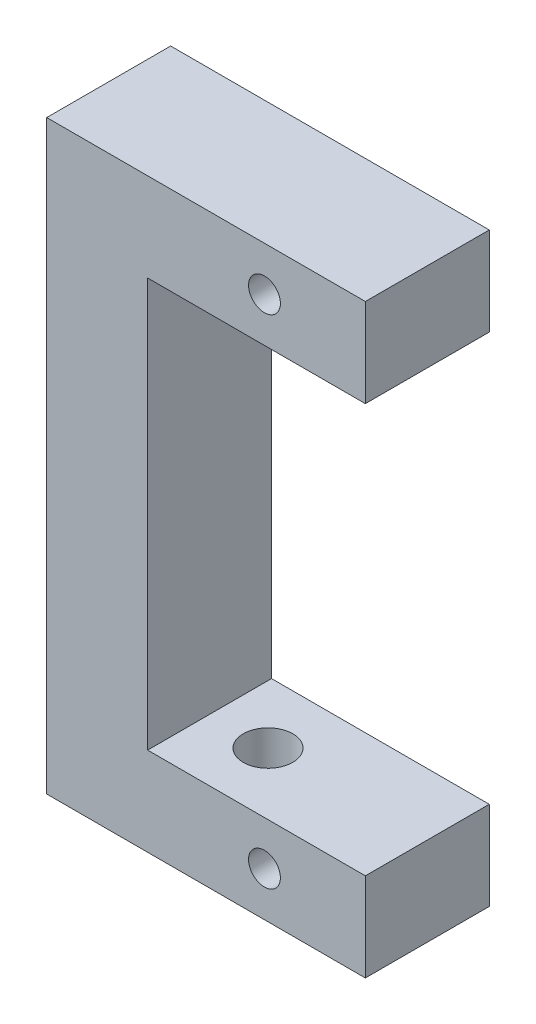
ISO-10303-21;
HEADER;
FILE_DESCRIPTION(('STEP AP214'),'2;1');
FILE_NAME('part.step','',(''),(''),'','','');
FILE_SCHEMA(('AUTOMOTIVE_DESIGN { 1 0 10303 214 1 1 1 1 }'));
ENDSEC;
DATA;
#1=APPLICATION_CONTEXT('core data for automotive mechanical design processes');
#2=APPLICATION_PROTOCOL_DEFINITION('international standard','automotive_design',2000,#1);
#3=PRODUCT_CONTEXT('',#1,'mechanical');
#4=PRODUCT('Part','Part','',(#3));
#5=PRODUCT_RELATED_PRODUCT_CATEGORY('part','',(#4));
#6=PRODUCT_DEFINITION_FORMATION('','',#4);
#7=PRODUCT_DEFINITION_CONTEXT('part definition',#1,'design');
#8=PRODUCT_DEFINITION('design','',#6,#7);
#9=PRODUCT_DEFINITION_SHAPE('','',#8);
#10=(LENGTH_UNIT() NAMED_UNIT(*) SI_UNIT(.MILLI.,.METRE.));
#11=(NAMED_UNIT(*) PLANE_ANGLE_UNIT() SI_UNIT($,.RADIAN.));
#12=(NAMED_UNIT(*) SI_UNIT($,.STERADIAN.) SOLID_ANGLE_UNIT());
#13=UNCERTAINTY_MEASURE_WITH_UNIT(LENGTH_MEASURE(1.E-05),#10,'distance_accuracy_value','');
#14=(GEOMETRIC_REPRESENTATION_CONTEXT(3) GLOBAL_UNCERTAINTY_ASSIGNED_CONTEXT((#13)) GLOBAL_UNIT_ASSIGNED_CONTEXT((#10,
#11,#12)) REPRESENTATION_CONTEXT('',''));
#15=CARTESIAN_POINT('',(0.,0.,0.));
#16=DIRECTION('',(0.,0.,1.));
#17=DIRECTION('',(1.,0.,0.));
#18=AXIS2_PLACEMENT_3D('',#15,#16,#17);
#19=CARTESIAN_POINT('',(8.30000000000001,16.55,7.));
#20=DIRECTION('',(-1.,0.,0.));
#21=DIRECTION('',(0.,-1.,0.));
#22=AXIS2_PLACEMENT_3D('',#19,#20,#21);
#23=PLANE('',#22);
#24=DIRECTION('',(0.,1.,0.));
#25=VECTOR('',#24,1.);
#26=CARTESIAN_POINT('',(8.30000000000001,16.55,0.));
#27=LINE('',#26,#25);
#28=CARTESIAN_POINT('',(8.3,11.55,0.));
#29=VERTEX_POINT('',#28);
#30=CARTESIAN_POINT('',(8.30000000000001,16.55,0.));
#31=VERTEX_POINT('',#30);
#32=EDGE_CURVE('E129',#29,#31,#27,.T.);
#33=ORIENTED_EDGE('',*,*,#32,.T.);
#34=DIRECTION('',(0.,0.,-1.));
#35=VECTOR('',#34,1.);
#36=CARTESIAN_POINT('',(8.30000000000001,16.55,7.));
#37=LINE('',#36,#35);
#38=CARTESIAN_POINT('',(8.30000000000001,16.55,7.));
#39=VERTEX_POINT('',#38);
#40=EDGE_CURVE('E11',#39,#31,#37,.T.);
#41=ORIENTED_EDGE('',*,*,#40,.F.);
#42=DIRECTION('',(0.,1.,0.));
#43=VECTOR('',#42,1.);
#44=CARTESIAN_POINT('',(8.30000000000001,16.55,7.));
#45=LINE('',#44,#43);
#46=CARTESIAN_POINT('',(8.3,11.55,7.));
#47=VERTEX_POINT('',#46);
#48=EDGE_CURVE('E144',#47,#39,#45,.T.);
#49=ORIENTED_EDGE('',*,*,#48,.F.);
#50=DIRECTION('',(0.,0.,-1.));
#51=VECTOR('',#50,1.);
#52=CARTESIAN_POINT('',(8.3,11.55,7.));
#53=LINE('',#52,#51);
#54=EDGE_CURVE('E125',#47,#29,#53,.T.);
#55=ORIENTED_EDGE('',*,*,#54,.T.);
#56=EDGE_LOOP('',(#33,#41,#49,#55));
#57=FACE_BOUND('',#56,.T.);
#58=ADVANCED_FACE('F33',(#57),#23,.F.);
#59=CARTESIAN_POINT('',(-9.69999999999999,16.55,7.));
#60=DIRECTION('',(0.,-1.,0.));
#61=DIRECTION('',(0.,0.,-1.));
#62=AXIS2_PLACEMENT_3D('',#59,#60,#61);
#63=PLANE('',#62);
#64=DIRECTION('',(-1.,0.,0.));
#65=VECTOR('',#64,1.);
#66=CARTESIAN_POINT('',(-9.69999999999999,16.55,0.));
#67=LINE('',#66,#65);
#68=CARTESIAN_POINT('',(-9.69999999999999,16.55,0.));
#69=VERTEX_POINT('',#68);
#70=EDGE_CURVE('E132',#31,#69,#67,.T.);
#71=ORIENTED_EDGE('',*,*,#70,.T.);
#72=DIRECTION('',(0.,0.,-1.));
#73=VECTOR('',#72,1.);
#74=CARTESIAN_POINT('',(-9.69999999999999,16.55,7.));
#75=LINE('',#74,#73);
#76=CARTESIAN_POINT('',(-9.69999999999999,16.55,7.));
#77=VERTEX_POINT('',#76);
#78=EDGE_CURVE('E41',#77,#69,#75,.T.);
#79=ORIENTED_EDGE('',*,*,#78,.F.);
#80=DIRECTION('',(-1.,0.,0.));
#81=VECTOR('',#80,1.);
#82=CARTESIAN_POINT('',(-9.69999999999999,16.55,7.));
#83=LINE('',#82,#81);
#84=EDGE_CURVE('E92',#39,#77,#83,.T.);
#85=ORIENTED_EDGE('',*,*,#84,.F.);
#86=ORIENTED_EDGE('',*,*,#40,.T.);
#87=EDGE_LOOP('',(#71,#79,#85,#86));
#88=FACE_BOUND('',#87,.T.);
#89=ADVANCED_FACE('F205',(#88),#63,.F.);
#90=CARTESIAN_POINT('',(-9.69999999999999,-16.55,7.));
#91=DIRECTION('',(1.,0.,0.));
#92=DIRECTION('',(0.,0.,-1.));
#93=AXIS2_PLACEMENT_3D('',#90,#91,#92);
#94=PLANE('',#93);
#95=DIRECTION('',(0.,-1.,0.));
#96=VECTOR('',#95,1.);
#97=CARTESIAN_POINT('',(-9.69999999999999,-16.55,0.));
#98=LINE('',#97,#96);
#99=CARTESIAN_POINT('',(-9.69999999999999,-16.55,0.));
#100=VERTEX_POINT('',#99);
#101=EDGE_CURVE('E135',#69,#100,#98,.T.);
#102=ORIENTED_EDGE('',*,*,#101,.T.);
#103=DIRECTION('',(0.,0.,-1.));
#104=VECTOR('',#103,1.);
#105=CARTESIAN_POINT('',(-9.69999999999999,-16.55,7.));
#106=LINE('',#105,#104);
#107=CARTESIAN_POINT('',(-9.69999999999999,-16.55,7.));
#108=VERTEX_POINT('',#107);
#109=EDGE_CURVE('E151',#108,#100,#106,.T.);
#110=ORIENTED_EDGE('',*,*,#109,.F.);
#111=DIRECTION('',(0.,-1.,0.));
#112=VECTOR('',#111,1.);
#113=CARTESIAN_POINT('',(-9.69999999999999,-16.55,7.));
#114=LINE('',#113,#112);
#115=EDGE_CURVE('E159',#77,#108,#114,.T.);
#116=ORIENTED_EDGE('',*,*,#115,.F.);
#117=ORIENTED_EDGE('',*,*,#78,.T.);
#118=EDGE_LOOP('',(#102,#110,#116,#117));
#119=FACE_BOUND('',#118,.T.);
#120=ADVANCED_FACE('F157',(#119),#94,.F.);
#121=CARTESIAN_POINT('',(8.30000000000001,-16.55,7.));
#122=DIRECTION('',(0.,1.,0.));
#123=DIRECTION('',(0.,0.,1.));
#124=AXIS2_PLACEMENT_3D('',#121,#122,#123);
#125=PLANE('',#124);
#126=CARTESIAN_POINT('',(-0.699999999999994,-16.55,3.5));
#127=DIRECTION('',(0.,-1.,0.));
#128=DIRECTION('',(0.,0.,-1.));
#129=AXIS2_PLACEMENT_3D('',#126,#127,#128);
#130=CIRCLE('',#129,1.4);
#131=CARTESIAN_POINT('',(-0.699999999999994,-16.55,2.1));
#132=VERTEX_POINT('',#131);
#133=EDGE_CURVE('E191',#132,#132,#130,.T.);
#134=ORIENTED_EDGE('',*,*,#133,.F.);
#135=EDGE_LOOP('',(#134));
#136=FACE_BOUND('',#135,.T.);
#137=DIRECTION('',(1.,0.,0.));
#138=VECTOR('',#137,1.);
#139=CARTESIAN_POINT('',(8.30000000000001,-16.55,0.));
#140=LINE('',#139,#138);
#141=CARTESIAN_POINT('',(8.30000000000001,-16.55,0.));
#142=VERTEX_POINT('',#141);
#143=EDGE_CURVE('E137',#100,#142,#140,.T.);
#144=ORIENTED_EDGE('',*,*,#143,.T.);
#145=DIRECTION('',(0.,0.,-1.));
#146=VECTOR('',#145,1.);
#147=CARTESIAN_POINT('',(8.30000000000001,-16.55,7.));
#148=LINE('',#147,#146);
#149=CARTESIAN_POINT('',(8.30000000000001,-16.55,7.));
#150=VERTEX_POINT('',#149);
#151=EDGE_CURVE('E148',#150,#142,#148,.T.);
#152=ORIENTED_EDGE('',*,*,#151,.F.);
#153=DIRECTION('',(1.,0.,0.));
#154=VECTOR('',#153,1.);
#155=CARTESIAN_POINT('',(8.30000000000001,-16.55,7.));
#156=LINE('',#155,#154);
#157=EDGE_CURVE('E171',#108,#150,#156,.T.);
#158=ORIENTED_EDGE('',*,*,#157,.F.);
#159=ORIENTED_EDGE('',*,*,#109,.T.);
#160=EDGE_LOOP('',(#144,#152,#158,#159));
#161=FACE_BOUND('',#160,.T.);
#162=ADVANCED_FACE('F167',(#136,#161),#125,.F.);
#163=CARTESIAN_POINT('',(8.3,-11.55,7.));
#164=DIRECTION('',(-1.,0.,0.));
#165=DIRECTION('',(0.,-1.,0.));
#166=AXIS2_PLACEMENT_3D('',#163,#164,#165);
#167=PLANE('',#166);
#168=DIRECTION('',(0.,1.,0.));
#169=VECTOR('',#168,1.);
#170=CARTESIAN_POINT('',(8.3,-11.55,0.));
#171=LINE('',#170,#169);
#172=CARTESIAN_POINT('',(8.3,-11.55,0.));
#173=VERTEX_POINT('',#172);
#174=EDGE_CURVE('E139',#142,#173,#171,.T.);
#175=ORIENTED_EDGE('',*,*,#174,.T.);
#176=DIRECTION('',(0.,0.,-1.));
#177=VECTOR('',#176,1.);
#178=CARTESIAN_POINT('',(8.3,-11.55,7.));
#179=LINE('',#178,#177);
#180=CARTESIAN_POINT('',(8.3,-11.55,7.));
#181=VERTEX_POINT('',#180);
#182=EDGE_CURVE('E120',#181,#173,#179,.T.);
#183=ORIENTED_EDGE('',*,*,#182,.F.);
#184=DIRECTION('',(0.,1.,0.));
#185=VECTOR('',#184,1.);
#186=CARTESIAN_POINT('',(8.3,-11.55,7.));
#187=LINE('',#186,#185);
#188=EDGE_CURVE('E111',#150,#181,#187,.T.);
#189=ORIENTED_EDGE('',*,*,#188,.F.);
#190=ORIENTED_EDGE('',*,*,#151,.T.);
#191=EDGE_LOOP('',(#175,#183,#189,#190));
#192=FACE_BOUND('',#191,.T.);
#193=ADVANCED_FACE('F170',(#192),#167,.F.);
#194=CARTESIAN_POINT('',(-4.,-11.55,7.));
#195=DIRECTION('',(0.,-1.,0.));
#196=DIRECTION('',(1.,0.,0.));
#197=AXIS2_PLACEMENT_3D('',#194,#195,#196);
#198=PLANE('',#197);
#199=CARTESIAN_POINT('',(-0.699999999999994,-11.55,3.5));
#200=DIRECTION('',(0.,-1.,0.));
#201=DIRECTION('',(1.,0.,0.));
#202=AXIS2_PLACEMENT_3D('',#199,#200,#201);
#203=CIRCLE('',#202,1.4);
#204=CARTESIAN_POINT('',(0.700000000000006,-11.55,3.5));
#205=VERTEX_POINT('',#204);
#206=EDGE_CURVE('E181',#205,#205,#203,.F.);
#207=ORIENTED_EDGE('',*,*,#206,.F.);
#208=EDGE_LOOP('',(#207));
#209=FACE_BOUND('',#208,.T.);
#210=DIRECTION('',(-1.,0.,0.));
#211=VECTOR('',#210,1.);
#212=CARTESIAN_POINT('',(-4.,-11.55,0.));
#213=LINE('',#212,#211);
#214=CARTESIAN_POINT('',(-4.,-11.55,0.));
#215=VERTEX_POINT('',#214);
#216=EDGE_CURVE('E119',#173,#215,#213,.T.);
#217=ORIENTED_EDGE('',*,*,#216,.T.);
#218=DIRECTION('',(0.,0.,-1.));
#219=VECTOR('',#218,1.);
#220=CARTESIAN_POINT('',(-4.,-11.55,7.));
#221=LINE('',#220,#219);
#222=CARTESIAN_POINT('',(-4.,-11.55,7.));
#223=VERTEX_POINT('',#222);
#224=EDGE_CURVE('E116',#223,#215,#221,.T.);
#225=ORIENTED_EDGE('',*,*,#224,.F.);
#226=DIRECTION('',(-1.,0.,0.));
#227=VECTOR('',#226,1.);
#228=CARTESIAN_POINT('',(-4.,-11.55,7.));
#229=LINE('',#228,#227);
#230=EDGE_CURVE('E105',#181,#223,#229,.T.);
#231=ORIENTED_EDGE('',*,*,#230,.F.);
#232=ORIENTED_EDGE('',*,*,#182,.T.);
#233=EDGE_LOOP('',(#217,#225,#231,#232));
#234=FACE_BOUND('',#233,.T.);
#235=ADVANCED_FACE('F117',(#209,#234),#198,.F.);
#236=CARTESIAN_POINT('',(-4.,11.55,7.));
#237=DIRECTION('',(-1.,0.,0.));
#238=DIRECTION('',(0.,0.,1.));
#239=AXIS2_PLACEMENT_3D('',#236,#237,#238);
#240=PLANE('',#239);
#241=DIRECTION('',(0.,1.,0.));
#242=VECTOR('',#241,1.);
#243=CARTESIAN_POINT('',(-4.,11.55,0.));
#244=LINE('',#243,#242);
#245=CARTESIAN_POINT('',(-4.,11.55,0.));
#246=VERTEX_POINT('',#245);
#247=EDGE_CURVE('E78',#215,#246,#244,.T.);
#248=ORIENTED_EDGE('',*,*,#247,.T.);
#249=DIRECTION('',(0.,0.,-1.));
#250=VECTOR('',#249,1.);
#251=CARTESIAN_POINT('',(-4.,11.55,7.));
#252=LINE('',#251,#250);
#253=CARTESIAN_POINT('',(-4.,11.55,7.));
#254=VERTEX_POINT('',#253);
#255=EDGE_CURVE('E121',#254,#246,#252,.T.);
#256=ORIENTED_EDGE('',*,*,#255,.F.);
#257=DIRECTION('',(0.,1.,0.));
#258=VECTOR('',#257,1.);
#259=CARTESIAN_POINT('',(-4.,11.55,7.));
#260=LINE('',#259,#258);
#261=EDGE_CURVE('E109',#223,#254,#260,.T.);
#262=ORIENTED_EDGE('',*,*,#261,.F.);
#263=ORIENTED_EDGE('',*,*,#224,.T.);
#264=EDGE_LOOP('',(#248,#256,#262,#263));
#265=FACE_BOUND('',#264,.T.);
#266=ADVANCED_FACE('F123',(#265),#240,.F.);
#267=CARTESIAN_POINT('',(8.3,11.55,7.));
#268=DIRECTION('',(0.,1.,0.));
#269=DIRECTION('',(-1.,0.,0.));
#270=AXIS2_PLACEMENT_3D('',#267,#268,#269);
#271=PLANE('',#270);
#272=DIRECTION('',(1.,0.,0.));
#273=VECTOR('',#272,1.);
#274=CARTESIAN_POINT('',(8.3,11.55,0.));
#275=LINE('',#274,#273);
#276=EDGE_CURVE('E84',#246,#29,#275,.T.);
#277=ORIENTED_EDGE('',*,*,#276,.T.);
#278=ORIENTED_EDGE('',*,*,#54,.F.);
#279=DIRECTION('',(1.,0.,0.));
#280=VECTOR('',#279,1.);
#281=CARTESIAN_POINT('',(8.3,11.55,7.));
#282=LINE('',#281,#280);
#283=EDGE_CURVE('E49',#254,#47,#282,.T.);
#284=ORIENTED_EDGE('',*,*,#283,.F.);
#285=ORIENTED_EDGE('',*,*,#255,.T.);
#286=EDGE_LOOP('',(#277,#278,#284,#285));
#287=FACE_BOUND('',#286,.T.);
#288=ADVANCED_FACE('F214',(#287),#271,.F.);
#289=CARTESIAN_POINT('',(0.,0.,7.));
#290=DIRECTION('',(0.,0.,-1.));
#291=DIRECTION('',(-1.,0.,0.));
#292=AXIS2_PLACEMENT_3D('',#289,#290,#291);
#293=PLANE('',#292);
#294=CARTESIAN_POINT('',(2.6,14.05,7.));
#295=DIRECTION('',(0.,0.,1.));
#296=DIRECTION('',(1.,0.,0.));
#297=AXIS2_PLACEMENT_3D('',#294,#295,#296);
#298=CIRCLE('',#297,0.9);
#299=CARTESIAN_POINT('',(3.5,14.05,7.));
#300=VERTEX_POINT('',#299);
#301=EDGE_CURVE('E184',#300,#300,#298,.T.);
#302=ORIENTED_EDGE('',*,*,#301,.F.);
#303=EDGE_LOOP('',(#302));
#304=FACE_BOUND('',#303,.T.);
#305=CARTESIAN_POINT('',(2.6,-14.05,7.));
#306=DIRECTION('',(0.,0.,1.));
#307=DIRECTION('',(-1.,0.,0.));
#308=AXIS2_PLACEMENT_3D('',#305,#306,#307);
#309=CIRCLE('',#308,0.9);
#310=CARTESIAN_POINT('',(1.7,-14.05,7.));
#311=VERTEX_POINT('',#310);
#312=EDGE_CURVE('E177',#311,#311,#309,.T.);
#313=ORIENTED_EDGE('',*,*,#312,.F.);
#314=EDGE_LOOP('',(#313));
#315=FACE_BOUND('',#314,.T.);
#316=ORIENTED_EDGE('',*,*,#48,.T.);
#317=ORIENTED_EDGE('',*,*,#84,.T.);
#318=ORIENTED_EDGE('',*,*,#115,.T.);
#319=ORIENTED_EDGE('',*,*,#157,.T.);
#320=ORIENTED_EDGE('',*,*,#188,.T.);
#321=ORIENTED_EDGE('',*,*,#230,.T.);
#322=ORIENTED_EDGE('',*,*,#261,.T.);
#323=ORIENTED_EDGE('',*,*,#283,.T.);
#324=EDGE_LOOP('',(#316,#317,#318,#319,#320,#321,#322,#323));
#325=FACE_BOUND('',#324,.T.);
#326=ADVANCED_FACE('F107',(#304,#315,#325),#293,.F.);
#327=CARTESIAN_POINT('',(0.,0.,0.));
#328=DIRECTION('',(0.,0.,-1.));
#329=DIRECTION('',(-1.,0.,0.));
#330=AXIS2_PLACEMENT_3D('',#327,#328,#329);
#331=PLANE('',#330);
#332=CARTESIAN_POINT('',(2.6,14.05,0.));
#333=DIRECTION('',(0.,0.,1.));
#334=DIRECTION('',(1.,0.,0.));
#335=AXIS2_PLACEMENT_3D('',#332,#333,#334);
#336=CIRCLE('',#335,0.9);
#337=CARTESIAN_POINT('',(3.5,14.05,0.));
#338=VERTEX_POINT('',#337);
#339=EDGE_CURVE('E133',#338,#338,#336,.T.);
#340=ORIENTED_EDGE('',*,*,#339,.T.);
#341=EDGE_LOOP('',(#340));
#342=FACE_BOUND('',#341,.T.);
#343=CARTESIAN_POINT('',(2.6,-14.05,0.));
#344=DIRECTION('',(0.,0.,1.));
#345=DIRECTION('',(-1.,0.,0.));
#346=AXIS2_PLACEMENT_3D('',#343,#344,#345);
#347=CIRCLE('',#346,0.9);
#348=CARTESIAN_POINT('',(1.7,-14.05,0.));
#349=VERTEX_POINT('',#348);
#350=EDGE_CURVE('E180',#349,#349,#347,.T.);
#351=ORIENTED_EDGE('',*,*,#350,.T.);
#352=EDGE_LOOP('',(#351));
#353=FACE_BOUND('',#352,.T.);
#354=ORIENTED_EDGE('',*,*,#32,.F.);
#355=ORIENTED_EDGE('',*,*,#276,.F.);
#356=ORIENTED_EDGE('',*,*,#247,.F.);
#357=ORIENTED_EDGE('',*,*,#216,.F.);
#358=ORIENTED_EDGE('',*,*,#174,.F.);
#359=ORIENTED_EDGE('',*,*,#143,.F.);
#360=ORIENTED_EDGE('',*,*,#101,.F.);
#361=ORIENTED_EDGE('',*,*,#70,.F.);
#362=EDGE_LOOP('',(#354,#355,#356,#357,#358,#359,#360,#361));
#363=FACE_BOUND('',#362,.T.);
#364=ADVANCED_FACE('F163',(#342,#353,#363),#331,.T.);
#365=CARTESIAN_POINT('',(2.6,-14.05,0.));
#366=DIRECTION('',(0.,0.,1.));
#367=DIRECTION('',(1.,0.,0.));
#368=AXIS2_PLACEMENT_3D('',#365,#366,#367);
#369=CYLINDRICAL_SURFACE('',#368,0.9);
#370=ORIENTED_EDGE('',*,*,#350,.F.);
#371=EDGE_LOOP('',(#370));
#372=FACE_BOUND('',#371,.T.);
#373=ORIENTED_EDGE('',*,*,#312,.T.);
#374=EDGE_LOOP('',(#373));
#375=FACE_BOUND('',#374,.T.);
#376=ADVANCED_FACE('F237',(#372,#375),#369,.F.);
#377=CARTESIAN_POINT('',(2.6,14.05,0.));
#378=DIRECTION('',(0.,0.,1.));
#379=DIRECTION('',(1.,0.,0.));
#380=AXIS2_PLACEMENT_3D('',#377,#378,#379);
#381=CYLINDRICAL_SURFACE('',#380,0.9);
#382=ORIENTED_EDGE('',*,*,#339,.F.);
#383=EDGE_LOOP('',(#382));
#384=FACE_BOUND('',#383,.T.);
#385=ORIENTED_EDGE('',*,*,#301,.T.);
#386=EDGE_LOOP('',(#385));
#387=FACE_BOUND('',#386,.T.);
#388=ADVANCED_FACE('F232',(#384,#387),#381,.F.);
#389=CARTESIAN_POINT('',(-0.699999999999994,16.551,3.5));
#390=DIRECTION('',(0.,-1.,0.));
#391=DIRECTION('',(0.,0.,-1.));
#392=AXIS2_PLACEMENT_3D('',#389,#390,#391);
#393=CYLINDRICAL_SURFACE('',#392,1.4);
#394=ORIENTED_EDGE('',*,*,#133,.T.);
#395=EDGE_LOOP('',(#394));
#396=FACE_BOUND('',#395,.T.);
#397=ORIENTED_EDGE('',*,*,#206,.T.);
#398=EDGE_LOOP('',(#397));
#399=FACE_BOUND('',#398,.T.);
#400=ADVANCED_FACE('F195',(#396,#399),#393,.F.);
#401=CLOSED_SHELL('',(#58,#89,#120,#162,#193,#235,#266,#288,#326,#364,#376,#388,#400));
#402=MANIFOLD_SOLID_BREP('B2',#401);
#403=ADVANCED_BREP_SHAPE_REPRESENTATION('',(#18,#402),#14);
#404=SHAPE_DEFINITION_REPRESENTATION(#9,#403);
ENDSEC;
END-ISO-10303-21;
